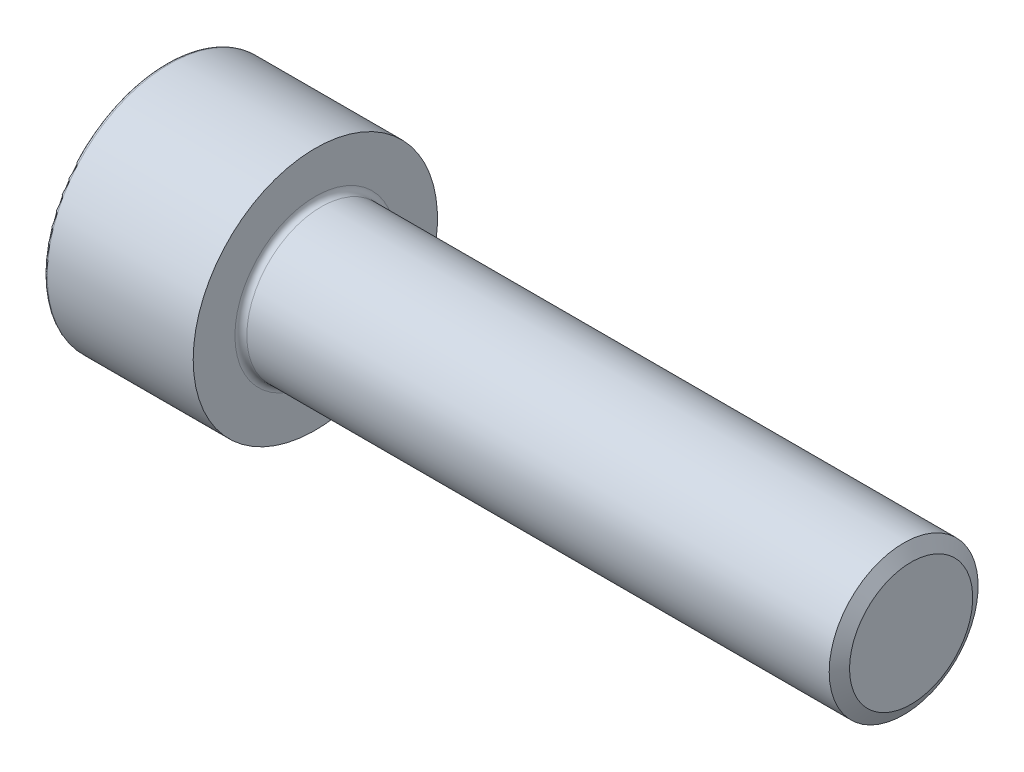
ISO-10303-21;
HEADER;
FILE_DESCRIPTION(('STEP AP214'),'2;1');
FILE_NAME('part.step','',(''),(''),'','','');
FILE_SCHEMA(('AUTOMOTIVE_DESIGN { 1 0 10303 214 1 1 1 1 }'));
ENDSEC;
DATA;
#1=APPLICATION_CONTEXT('core data for automotive mechanical design processes');
#2=APPLICATION_PROTOCOL_DEFINITION('international standard','automotive_design',2000,#1);
#3=PRODUCT_CONTEXT('',#1,'mechanical');
#4=PRODUCT('Part','Part','',(#3));
#5=PRODUCT_RELATED_PRODUCT_CATEGORY('part','',(#4));
#6=PRODUCT_DEFINITION_FORMATION('','',#4);
#7=PRODUCT_DEFINITION_CONTEXT('part definition',#1,'design');
#8=PRODUCT_DEFINITION('design','',#6,#7);
#9=PRODUCT_DEFINITION_SHAPE('','',#8);
#10=(LENGTH_UNIT() NAMED_UNIT(*) SI_UNIT(.MILLI.,.METRE.));
#11=(NAMED_UNIT(*) PLANE_ANGLE_UNIT() SI_UNIT($,.RADIAN.));
#12=(NAMED_UNIT(*) SI_UNIT($,.STERADIAN.) SOLID_ANGLE_UNIT());
#13=UNCERTAINTY_MEASURE_WITH_UNIT(LENGTH_MEASURE(1.E-05),#10,'distance_accuracy_value','');
#14=(GEOMETRIC_REPRESENTATION_CONTEXT(3) GLOBAL_UNCERTAINTY_ASSIGNED_CONTEXT((#13)) GLOBAL_UNIT_ASSIGNED_CONTEXT((#10,
#11,#12)) REPRESENTATION_CONTEXT('',''));
#15=CARTESIAN_POINT('',(0.,0.,0.));
#16=DIRECTION('',(0.,0.,1.));
#17=DIRECTION('',(1.,0.,0.));
#18=AXIS2_PLACEMENT_3D('',#15,#16,#17);
#19=CARTESIAN_POINT('',(0.,0.,0.));
#20=DIRECTION('',(-1.,0.,0.));
#21=DIRECTION('',(0.,0.,1.));
#22=AXIS2_PLACEMENT_3D('',#19,#20,#21);
#23=CYLINDRICAL_SURFACE('',#22,2.5);
#24=CARTESIAN_POINT('',(5.2,0.,0.));
#25=DIRECTION('',(-1.,0.,0.));
#26=DIRECTION('',(0.,0.,1.));
#27=AXIS2_PLACEMENT_3D('',#24,#25,#26);
#28=CIRCLE('',#27,2.5);
#29=CARTESIAN_POINT('',(5.2,0.,2.5));
#30=VERTEX_POINT('',#29);
#31=EDGE_CURVE('E144',#30,#30,#28,.T.);
#32=ORIENTED_EDGE('',*,*,#31,.F.);
#33=EDGE_LOOP('',(#32));
#34=FACE_BOUND('',#33,.T.);
#35=CARTESIAN_POINT('',(24.7500073334409,0.,0.));
#36=DIRECTION('',(-1.,0.,0.));
#37=DIRECTION('',(0.,0.,1.));
#38=AXIS2_PLACEMENT_3D('',#35,#36,#37);
#39=CIRCLE('',#38,2.5);
#40=CARTESIAN_POINT('',(24.7500073334409,0.,2.5));
#41=VERTEX_POINT('',#40);
#42=EDGE_CURVE('E281',#41,#41,#39,.T.);
#43=ORIENTED_EDGE('',*,*,#42,.T.);
#44=EDGE_LOOP('',(#43));
#45=FACE_BOUND('',#44,.T.);
#46=ADVANCED_FACE('F41',(#34,#45),#23,.T.);
#47=CARTESIAN_POINT('',(0.,0.,0.));
#48=DIRECTION('',(1.,0.,0.));
#49=DIRECTION('',(0.,0.,-1.));
#50=AXIS2_PLACEMENT_3D('',#47,#48,#49);
#51=PLANE('',#50);
#52=CARTESIAN_POINT('',(0.,0.,0.));
#53=DIRECTION('',(1.,0.,0.));
#54=DIRECTION('',(0.,0.,-1.));
#55=AXIS2_PLACEMENT_3D('',#52,#53,#54);
#56=CIRCLE('',#55,4.);
#57=CARTESIAN_POINT('',(0.,0.,-4.));
#58=VERTEX_POINT('',#57);
#59=EDGE_CURVE('E49',#58,#58,#56,.F.);
#60=ORIENTED_EDGE('',*,*,#59,.T.);
#61=EDGE_LOOP('',(#60));
#62=FACE_BOUND('',#61,.T.);
#63=DIRECTION('',(0.,0.866025403784438,-0.5));
#64=VECTOR('',#63,1.);
#65=CARTESIAN_POINT('',(0.,0.,2.));
#66=LINE('',#65,#64);
#67=CARTESIAN_POINT('',(0.,0.,2.));
#68=VERTEX_POINT('',#67);
#69=CARTESIAN_POINT('',(0.,1.73205080756888,0.999999999999999));
#70=VERTEX_POINT('',#69);
#71=EDGE_CURVE('E130',#68,#70,#66,.T.);
#72=ORIENTED_EDGE('',*,*,#71,.F.);
#73=DIRECTION('',(0.,0.866025403784439,0.5));
#74=VECTOR('',#73,1.);
#75=CARTESIAN_POINT('',(0.,-1.73205080756888,1.));
#76=LINE('',#75,#74);
#77=CARTESIAN_POINT('',(0.,-1.73205080756888,1.));
#78=VERTEX_POINT('',#77);
#79=EDGE_CURVE('E56',#78,#68,#76,.T.);
#80=ORIENTED_EDGE('',*,*,#79,.F.);
#81=DIRECTION('',(0.,0.,1.));
#82=VECTOR('',#81,1.);
#83=CARTESIAN_POINT('',(0.,-1.73205080756888,-1.));
#84=LINE('',#83,#82);
#85=CARTESIAN_POINT('',(0.,-1.73205080756888,-1.));
#86=VERTEX_POINT('',#85);
#87=EDGE_CURVE('E140',#86,#78,#84,.T.);
#88=ORIENTED_EDGE('',*,*,#87,.F.);
#89=DIRECTION('',(0.,-0.866025403784438,0.5));
#90=VECTOR('',#89,1.);
#91=CARTESIAN_POINT('',(0.,0.,-2.));
#92=LINE('',#91,#90);
#93=CARTESIAN_POINT('',(0.,0.,-2.));
#94=VERTEX_POINT('',#93);
#95=EDGE_CURVE('E138',#94,#86,#92,.T.);
#96=ORIENTED_EDGE('',*,*,#95,.F.);
#97=DIRECTION('',(0.,-0.866025403784439,-0.5));
#98=VECTOR('',#97,1.);
#99=CARTESIAN_POINT('',(0.,1.73205080756888,-1.));
#100=LINE('',#99,#98);
#101=CARTESIAN_POINT('',(0.,1.73205080756888,-1.));
#102=VERTEX_POINT('',#101);
#103=EDGE_CURVE('E104',#102,#94,#100,.T.);
#104=ORIENTED_EDGE('',*,*,#103,.F.);
#105=DIRECTION('',(0.,0.,-1.));
#106=VECTOR('',#105,1.);
#107=CARTESIAN_POINT('',(0.,1.73205080756888,0.999999999999999));
#108=LINE('',#107,#106);
#109=EDGE_CURVE('E134',#70,#102,#108,.T.);
#110=ORIENTED_EDGE('',*,*,#109,.F.);
#111=EDGE_LOOP('',(#72,#80,#88,#96,#104,#110));
#112=FACE_BOUND('',#111,.T.);
#113=ADVANCED_FACE('F161',(#62,#112),#51,.F.);
#114=CARTESIAN_POINT('',(0.,0.,0.));
#115=DIRECTION('',(-1.,0.,0.));
#116=DIRECTION('',(0.,0.,1.));
#117=AXIS2_PLACEMENT_3D('',#114,#115,#116);
#118=CYLINDRICAL_SURFACE('',#117,4.1);
#119=CARTESIAN_POINT('',(0.1,0.,0.));
#120=DIRECTION('',(1.,0.,0.));
#121=DIRECTION('',(0.,0.,-1.));
#122=AXIS2_PLACEMENT_3D('',#119,#120,#121);
#123=CIRCLE('',#122,4.1);
#124=CARTESIAN_POINT('',(0.1,0.,-4.1));
#125=VERTEX_POINT('',#124);
#126=EDGE_CURVE('E11',#125,#125,#123,.T.);
#127=ORIENTED_EDGE('',*,*,#126,.T.);
#128=EDGE_LOOP('',(#127));
#129=FACE_BOUND('',#128,.T.);
#130=CARTESIAN_POINT('',(5.,0.,0.));
#131=DIRECTION('',(-1.,0.,0.));
#132=DIRECTION('',(0.,0.,1.));
#133=AXIS2_PLACEMENT_3D('',#130,#131,#132);
#134=CIRCLE('',#133,4.1);
#135=CARTESIAN_POINT('',(5.,0.,4.1));
#136=VERTEX_POINT('',#135);
#137=EDGE_CURVE('E155',#136,#136,#134,.T.);
#138=ORIENTED_EDGE('',*,*,#137,.T.);
#139=EDGE_LOOP('',(#138));
#140=FACE_BOUND('',#139,.T.);
#141=ADVANCED_FACE('F180',(#129,#140),#118,.T.);
#142=CARTESIAN_POINT('',(5.,4.1,0.));
#143=DIRECTION('',(-1.,0.,0.));
#144=DIRECTION('',(0.,0.,1.));
#145=AXIS2_PLACEMENT_3D('',#142,#143,#144);
#146=PLANE('',#145);
#147=ORIENTED_EDGE('',*,*,#137,.F.);
#148=EDGE_LOOP('',(#147));
#149=FACE_BOUND('',#148,.T.);
#150=CARTESIAN_POINT('',(5.,0.,0.));
#151=DIRECTION('',(-1.,0.,0.));
#152=DIRECTION('',(0.,0.,1.));
#153=AXIS2_PLACEMENT_3D('',#150,#151,#152);
#154=CIRCLE('',#153,2.7);
#155=CARTESIAN_POINT('',(5.,0.,2.7));
#156=VERTEX_POINT('',#155);
#157=EDGE_CURVE('E152',#156,#156,#154,.T.);
#158=ORIENTED_EDGE('',*,*,#157,.T.);
#159=EDGE_LOOP('',(#158));
#160=FACE_BOUND('',#159,.T.);
#161=ADVANCED_FACE('F189',(#149,#160),#146,.F.);
#162=CARTESIAN_POINT('',(5.2,0.,0.));
#163=DIRECTION('',(-1.,0.,0.));
#164=DIRECTION('',(0.,0.,1.));
#165=AXIS2_PLACEMENT_3D('',#162,#163,#164);
#166=TOROIDAL_SURFACE('',#165,2.7,0.199999999999999);
#167=ORIENTED_EDGE('',*,*,#157,.F.);
#168=EDGE_LOOP('',(#167));
#169=FACE_BOUND('',#168,.T.);
#170=ORIENTED_EDGE('',*,*,#31,.T.);
#171=EDGE_LOOP('',(#170));
#172=FACE_BOUND('',#171,.T.);
#173=ADVANCED_FACE('F185',(#169,#172),#166,.F.);
#174=CARTESIAN_POINT('',(1.3,-1.73205080756888,1.));
#175=DIRECTION('',(0.,-0.5,0.866025403784439));
#176=DIRECTION('',(0.,-0.866025403784439,-0.5));
#177=AXIS2_PLACEMENT_3D('',#174,#175,#176);
#178=PLANE('',#177);
#179=ORIENTED_EDGE('',*,*,#79,.T.);
#180=DIRECTION('',(-1.,0.,0.));
#181=VECTOR('',#180,1.);
#182=CARTESIAN_POINT('',(1.3,0.,2.));
#183=LINE('',#182,#181);
#184=CARTESIAN_POINT('',(1.3,0.,2.));
#185=VERTEX_POINT('',#184);
#186=EDGE_CURVE('E86',#185,#68,#183,.T.);
#187=ORIENTED_EDGE('',*,*,#186,.F.);
#188=DIRECTION('',(0.,0.866025403784439,0.5));
#189=VECTOR('',#188,1.);
#190=CARTESIAN_POINT('',(1.3,-1.73205080756888,1.));
#191=LINE('',#190,#189);
#192=CARTESIAN_POINT('',(1.3,-1.73205080756888,1.));
#193=VERTEX_POINT('',#192);
#194=EDGE_CURVE('E142',#193,#185,#191,.T.);
#195=ORIENTED_EDGE('',*,*,#194,.F.);
#196=DIRECTION('',(-1.,0.,0.));
#197=VECTOR('',#196,1.);
#198=CARTESIAN_POINT('',(1.3,-1.73205080756888,1.));
#199=LINE('',#198,#197);
#200=EDGE_CURVE('E64',#193,#78,#199,.T.);
#201=ORIENTED_EDGE('',*,*,#200,.T.);
#202=EDGE_LOOP('',(#179,#187,#195,#201));
#203=FACE_BOUND('',#202,.T.);
#204=ADVANCED_FACE('F188',(#203),#178,.F.);
#205=CARTESIAN_POINT('',(1.3,-1.73205080756888,-1.));
#206=DIRECTION('',(0.,-1.,0.));
#207=DIRECTION('',(0.,0.,-1.));
#208=AXIS2_PLACEMENT_3D('',#205,#206,#207);
#209=PLANE('',#208);
#210=ORIENTED_EDGE('',*,*,#87,.T.);
#211=ORIENTED_EDGE('',*,*,#200,.F.);
#212=DIRECTION('',(0.,0.,1.));
#213=VECTOR('',#212,1.);
#214=CARTESIAN_POINT('',(1.3,-1.73205080756888,-1.));
#215=LINE('',#214,#213);
#216=CARTESIAN_POINT('',(1.3,-1.73205080756888,-1.));
#217=VERTEX_POINT('',#216);
#218=EDGE_CURVE('E116',#217,#193,#215,.T.);
#219=ORIENTED_EDGE('',*,*,#218,.F.);
#220=DIRECTION('',(-1.,0.,0.));
#221=VECTOR('',#220,1.);
#222=CARTESIAN_POINT('',(1.3,-1.73205080756888,-1.));
#223=LINE('',#222,#221);
#224=EDGE_CURVE('E108',#217,#86,#223,.T.);
#225=ORIENTED_EDGE('',*,*,#224,.T.);
#226=EDGE_LOOP('',(#210,#211,#219,#225));
#227=FACE_BOUND('',#226,.T.);
#228=ADVANCED_FACE('F219',(#227),#209,.F.);
#229=CARTESIAN_POINT('',(1.3,0.,-2.));
#230=DIRECTION('',(0.,-0.5,-0.866025403784438));
#231=DIRECTION('',(0.,0.866025403784439,-0.5));
#232=AXIS2_PLACEMENT_3D('',#229,#230,#231);
#233=PLANE('',#232);
#234=ORIENTED_EDGE('',*,*,#95,.T.);
#235=ORIENTED_EDGE('',*,*,#224,.F.);
#236=DIRECTION('',(0.,-0.866025403784438,0.5));
#237=VECTOR('',#236,1.);
#238=CARTESIAN_POINT('',(1.3,0.,-2.));
#239=LINE('',#238,#237);
#240=CARTESIAN_POINT('',(1.3,0.,-2.));
#241=VERTEX_POINT('',#240);
#242=EDGE_CURVE('E112',#241,#217,#239,.T.);
#243=ORIENTED_EDGE('',*,*,#242,.F.);
#244=DIRECTION('',(-1.,0.,0.));
#245=VECTOR('',#244,1.);
#246=CARTESIAN_POINT('',(1.3,0.,-2.));
#247=LINE('',#246,#245);
#248=EDGE_CURVE('E97',#241,#94,#247,.T.);
#249=ORIENTED_EDGE('',*,*,#248,.T.);
#250=EDGE_LOOP('',(#234,#235,#243,#249));
#251=FACE_BOUND('',#250,.T.);
#252=ADVANCED_FACE('F113',(#251),#233,.F.);
#253=CARTESIAN_POINT('',(1.3,1.73205080756888,-1.));
#254=DIRECTION('',(0.,0.5,-0.866025403784439));
#255=DIRECTION('',(0.,0.866025403784439,0.5));
#256=AXIS2_PLACEMENT_3D('',#253,#254,#255);
#257=PLANE('',#256);
#258=ORIENTED_EDGE('',*,*,#103,.T.);
#259=ORIENTED_EDGE('',*,*,#248,.F.);
#260=DIRECTION('',(0.,-0.866025403784439,-0.5));
#261=VECTOR('',#260,1.);
#262=CARTESIAN_POINT('',(1.3,1.73205080756888,-1.));
#263=LINE('',#262,#261);
#264=CARTESIAN_POINT('',(1.3,1.73205080756888,-1.));
#265=VERTEX_POINT('',#264);
#266=EDGE_CURVE('E101',#265,#241,#263,.T.);
#267=ORIENTED_EDGE('',*,*,#266,.F.);
#268=DIRECTION('',(-1.,0.,0.));
#269=VECTOR('',#268,1.);
#270=CARTESIAN_POINT('',(1.3,1.73205080756888,-1.));
#271=LINE('',#270,#269);
#272=EDGE_CURVE('E109',#265,#102,#271,.T.);
#273=ORIENTED_EDGE('',*,*,#272,.T.);
#274=EDGE_LOOP('',(#258,#259,#267,#273));
#275=FACE_BOUND('',#274,.T.);
#276=ADVANCED_FACE('F99',(#275),#257,.F.);
#277=CARTESIAN_POINT('',(1.3,1.73205080756888,0.999999999999999));
#278=DIRECTION('',(0.,1.,0.));
#279=DIRECTION('',(0.,0.,1.));
#280=AXIS2_PLACEMENT_3D('',#277,#278,#279);
#281=PLANE('',#280);
#282=ORIENTED_EDGE('',*,*,#109,.T.);
#283=ORIENTED_EDGE('',*,*,#272,.F.);
#284=DIRECTION('',(0.,0.,-1.));
#285=VECTOR('',#284,1.);
#286=CARTESIAN_POINT('',(1.3,1.73205080756888,0.999999999999999));
#287=LINE('',#286,#285);
#288=CARTESIAN_POINT('',(1.3,1.73205080756888,0.999999999999999));
#289=VERTEX_POINT('',#288);
#290=EDGE_CURVE('E122',#289,#265,#287,.T.);
#291=ORIENTED_EDGE('',*,*,#290,.F.);
#292=DIRECTION('',(-1.,0.,0.));
#293=VECTOR('',#292,1.);
#294=CARTESIAN_POINT('',(1.3,1.73205080756888,0.999999999999999));
#295=LINE('',#294,#293);
#296=EDGE_CURVE('E147',#289,#70,#295,.T.);
#297=ORIENTED_EDGE('',*,*,#296,.T.);
#298=EDGE_LOOP('',(#282,#283,#291,#297));
#299=FACE_BOUND('',#298,.T.);
#300=ADVANCED_FACE('F237',(#299),#281,.F.);
#301=CARTESIAN_POINT('',(1.3,0.,2.));
#302=DIRECTION('',(0.,0.5,0.866025403784439));
#303=DIRECTION('',(0.,-0.866025403784439,0.5));
#304=AXIS2_PLACEMENT_3D('',#301,#302,#303);
#305=PLANE('',#304);
#306=ORIENTED_EDGE('',*,*,#71,.T.);
#307=ORIENTED_EDGE('',*,*,#296,.F.);
#308=DIRECTION('',(0.,0.866025403784438,-0.5));
#309=VECTOR('',#308,1.);
#310=CARTESIAN_POINT('',(1.3,0.,2.));
#311=LINE('',#310,#309);
#312=EDGE_CURVE('E124',#185,#289,#311,.T.);
#313=ORIENTED_EDGE('',*,*,#312,.F.);
#314=ORIENTED_EDGE('',*,*,#186,.T.);
#315=EDGE_LOOP('',(#306,#307,#313,#314));
#316=FACE_BOUND('',#315,.T.);
#317=ADVANCED_FACE('F244',(#316),#305,.F.);
#318=CARTESIAN_POINT('',(1.3,-1.73205080756888,1.));
#319=DIRECTION('',(1.,0.,0.));
#320=DIRECTION('',(0.,0.,-1.));
#321=AXIS2_PLACEMENT_3D('',#318,#319,#320);
#322=PLANE('',#321);
#323=ORIENTED_EDGE('',*,*,#194,.T.);
#324=ORIENTED_EDGE('',*,*,#312,.T.);
#325=ORIENTED_EDGE('',*,*,#290,.T.);
#326=ORIENTED_EDGE('',*,*,#266,.T.);
#327=ORIENTED_EDGE('',*,*,#242,.T.);
#328=ORIENTED_EDGE('',*,*,#218,.T.);
#329=EDGE_LOOP('',(#323,#324,#325,#326,#327,#328));
#330=FACE_BOUND('',#329,.T.);
#331=ADVANCED_FACE('F119',(#330),#322,.F.);
#332=CARTESIAN_POINT('',(24.7500073334409,0.,0.));
#333=DIRECTION('',(-1.,0.,0.));
#334=DIRECTION('',(0.,0.,1.));
#335=AXIS2_PLACEMENT_3D('',#332,#333,#334);
#336=CONICAL_SURFACE('',#335,2.5,1.04719755119659);
#337=CARTESIAN_POINT('',(25.,0.,0.));
#338=DIRECTION('',(-1.,0.,0.));
#339=DIRECTION('',(0.,0.,1.));
#340=AXIS2_PLACEMENT_3D('',#337,#338,#339);
#341=CIRCLE('',#340,2.067);
#342=CARTESIAN_POINT('',(25.,0.,2.067));
#343=VERTEX_POINT('',#342);
#344=EDGE_CURVE('E131',#343,#343,#341,.T.);
#345=ORIENTED_EDGE('',*,*,#344,.T.);
#346=EDGE_LOOP('',(#345));
#347=FACE_BOUND('',#346,.T.);
#348=ORIENTED_EDGE('',*,*,#42,.F.);
#349=EDGE_LOOP('',(#348));
#350=FACE_BOUND('',#349,.T.);
#351=ADVANCED_FACE('F170',(#347,#350),#336,.T.);
#352=CARTESIAN_POINT('',(25.,2.5,0.));
#353=DIRECTION('',(-1.,0.,0.));
#354=DIRECTION('',(0.,0.,1.));
#355=AXIS2_PLACEMENT_3D('',#352,#353,#354);
#356=PLANE('',#355);
#357=ORIENTED_EDGE('',*,*,#344,.F.);
#358=EDGE_LOOP('',(#357));
#359=FACE_BOUND('',#358,.T.);
#360=ADVANCED_FACE('F165',(#359),#356,.F.);
#361=CARTESIAN_POINT('',(0.1,0.,0.));
#362=DIRECTION('',(1.,0.,0.));
#363=DIRECTION('',(0.,0.,-1.));
#364=AXIS2_PLACEMENT_3D('',#361,#362,#363);
#365=TOROIDAL_SURFACE('',#364,4.,0.1);
#366=ORIENTED_EDGE('',*,*,#126,.F.);
#367=EDGE_LOOP('',(#366));
#368=FACE_BOUND('',#367,.T.);
#369=ORIENTED_EDGE('',*,*,#59,.F.);
#370=EDGE_LOOP('',(#369));
#371=FACE_BOUND('',#370,.T.);
#372=ADVANCED_FACE('F43',(#368,#371),#365,.T.);
#373=CLOSED_SHELL('',(#46,#113,#141,#161,#173,#204,#228,#252,#276,#300,#317,#331,#351,#360,#372));
#374=MANIFOLD_SOLID_BREP('B2',#373);
#375=ADVANCED_BREP_SHAPE_REPRESENTATION('',(#18,#374),#14);
#376=SHAPE_DEFINITION_REPRESENTATION(#9,#375);
ENDSEC;
END-ISO-10303-21;
